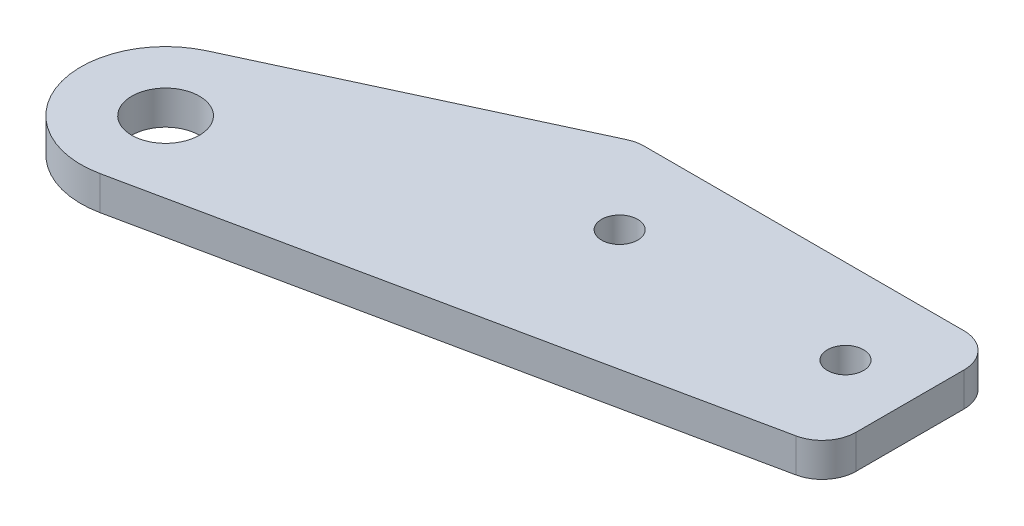
ISO-10303-21;
HEADER;
FILE_DESCRIPTION(('STEP AP214'),'2;1');
FILE_NAME('part.step','',(''),(''),'','','');
FILE_SCHEMA(('AUTOMOTIVE_DESIGN { 1 0 10303 214 1 1 1 1 }'));
ENDSEC;
DATA;
#1=APPLICATION_CONTEXT('core data for automotive mechanical design processes');
#2=APPLICATION_PROTOCOL_DEFINITION('international standard','automotive_design',2000,#1);
#3=PRODUCT_CONTEXT('',#1,'mechanical');
#4=PRODUCT('Part','Part','',(#3));
#5=PRODUCT_RELATED_PRODUCT_CATEGORY('part','',(#4));
#6=PRODUCT_DEFINITION_FORMATION('','',#4);
#7=PRODUCT_DEFINITION_CONTEXT('part definition',#1,'design');
#8=PRODUCT_DEFINITION('design','',#6,#7);
#9=PRODUCT_DEFINITION_SHAPE('','',#8);
#10=(LENGTH_UNIT() NAMED_UNIT(*) SI_UNIT(.MILLI.,.METRE.));
#11=(NAMED_UNIT(*) PLANE_ANGLE_UNIT() SI_UNIT($,.RADIAN.));
#12=(NAMED_UNIT(*) SI_UNIT($,.STERADIAN.) SOLID_ANGLE_UNIT());
#13=UNCERTAINTY_MEASURE_WITH_UNIT(LENGTH_MEASURE(1.E-05),#10,'distance_accuracy_value','');
#14=(GEOMETRIC_REPRESENTATION_CONTEXT(3) GLOBAL_UNCERTAINTY_ASSIGNED_CONTEXT((#13)) GLOBAL_UNIT_ASSIGNED_CONTEXT((#10,
#11,#12)) REPRESENTATION_CONTEXT('',''));
#15=CARTESIAN_POINT('',(0.,0.,0.));
#16=DIRECTION('',(0.,0.,1.));
#17=DIRECTION('',(1.,0.,0.));
#18=AXIS2_PLACEMENT_3D('',#15,#16,#17);
#19=CARTESIAN_POINT('',(1.35277226534862,3.,6.43884459272465));
#20=DIRECTION('',(0.205606744276895,0.,0.97863469522997));
#21=DIRECTION('',(0.97863469522997,0.,-0.205606744276895));
#22=AXIS2_PLACEMENT_3D('',#19,#20,#21);
#23=PLANE('',#22);
#24=DIRECTION('',(-0.97863469522997,0.,0.205606744276895));
#25=VECTOR('',#24,1.);
#26=CARTESIAN_POINT('',(1.35277226534862,0.,6.43884459272465));
#27=LINE('',#26,#25);
#28=CARTESIAN_POINT('',(29.6168202328307,0.,0.50069534152282));
#29=VERTEX_POINT('',#28);
#30=CARTESIAN_POINT('',(-21.3079494179233,0.,11.1997602142248));
#31=VERTEX_POINT('',#30);
#32=EDGE_CURVE('E158',#29,#31,#27,.T.);
#33=ORIENTED_EDGE('',*,*,#32,.F.);
#34=DIRECTION('',(0.,-1.,0.));
#35=VECTOR('',#34,1.);
#36=CARTESIAN_POINT('',(29.6168202328307,3.,0.500695341522821));
#37=LINE('',#36,#35);
#38=CARTESIAN_POINT('',(29.6168202328307,3.,0.50069534152282));
#39=VERTEX_POINT('',#38);
#40=EDGE_CURVE('E11',#29,#39,#37,.F.);
#41=ORIENTED_EDGE('',*,*,#40,.T.);
#42=DIRECTION('',(-0.97863469522997,0.,0.205606744276895));
#43=VECTOR('',#42,1.);
#44=CARTESIAN_POINT('',(1.35277226534862,3.,6.43884459272465));
#45=LINE('',#44,#43);
#46=CARTESIAN_POINT('',(-21.3079494179233,3.,11.1997602142248));
#47=VERTEX_POINT('',#46);
#48=EDGE_CURVE('E185',#39,#47,#45,.T.);
#49=ORIENTED_EDGE('',*,*,#48,.T.);
#50=DIRECTION('',(0.,-1.,0.));
#51=VECTOR('',#50,1.);
#52=CARTESIAN_POINT('',(-21.3079494179233,3.,11.1997602142248));
#53=LINE('',#52,#51);
#54=EDGE_CURVE('E138',#47,#31,#53,.T.);
#55=ORIENTED_EDGE('',*,*,#54,.T.);
#56=EDGE_LOOP('',(#33,#41,#49,#55));
#57=FACE_BOUND('',#56,.T.);
#58=ADVANCED_FACE('F46',(#57),#23,.T.);
#59=CARTESIAN_POINT('',(32.,3.,0.));
#60=DIRECTION('',(-1.,0.,0.));
#61=DIRECTION('',(0.,0.,1.));
#62=AXIS2_PLACEMENT_3D('',#59,#60,#61);
#63=PLANE('',#62);
#64=DIRECTION('',(0.,0.,-1.));
#65=VECTOR('',#64,1.);
#66=CARTESIAN_POINT('',(32.,3.,0.));
#67=LINE('',#66,#65);
#68=CARTESIAN_POINT('',(32.,3.,-2.43520874416709));
#69=VERTEX_POINT('',#68);
#70=CARTESIAN_POINT('',(32.,3.,-12.));
#71=VERTEX_POINT('',#70);
#72=EDGE_CURVE('E219',#69,#71,#67,.T.);
#73=ORIENTED_EDGE('',*,*,#72,.F.);
#74=DIRECTION('',(0.,-1.,0.));
#75=VECTOR('',#74,1.);
#76=CARTESIAN_POINT('',(32.,0.,-2.43520874416709));
#77=LINE('',#76,#75);
#78=CARTESIAN_POINT('',(32.,0.,-2.43520874416709));
#79=VERTEX_POINT('',#78);
#80=EDGE_CURVE('E55',#69,#79,#77,.T.);
#81=ORIENTED_EDGE('',*,*,#80,.T.);
#82=DIRECTION('',(0.,0.,-1.));
#83=VECTOR('',#82,1.);
#84=CARTESIAN_POINT('',(32.,0.,0.));
#85=LINE('',#84,#83);
#86=CARTESIAN_POINT('',(32.,0.,-12.));
#87=VERTEX_POINT('',#86);
#88=EDGE_CURVE('E161',#79,#87,#85,.T.);
#89=ORIENTED_EDGE('',*,*,#88,.T.);
#90=DIRECTION('',(0.,-1.,0.));
#91=VECTOR('',#90,1.);
#92=CARTESIAN_POINT('',(32.,3.,-12.));
#93=LINE('',#92,#91);
#94=EDGE_CURVE('E62',#87,#71,#93,.F.);
#95=ORIENTED_EDGE('',*,*,#94,.T.);
#96=EDGE_LOOP('',(#73,#81,#89,#95));
#97=FACE_BOUND('',#96,.T.);
#98=ADVANCED_FACE('F218',(#97),#63,.F.);
#99=CARTESIAN_POINT('',(0.,3.,-15.));
#100=DIRECTION('',(0.,0.,-1.));
#101=DIRECTION('',(-1.,0.,0.));
#102=AXIS2_PLACEMENT_3D('',#99,#100,#101);
#103=PLANE('',#102);
#104=DIRECTION('',(1.,0.,0.));
#105=VECTOR('',#104,1.);
#106=CARTESIAN_POINT('',(0.,0.,-15.));
#107=LINE('',#106,#105);
#108=CARTESIAN_POINT('',(0.66157955679861,0.,-15.));
#109=VERTEX_POINT('',#108);
#110=CARTESIAN_POINT('',(29.,0.,-15.));
#111=VERTEX_POINT('',#110);
#112=EDGE_CURVE('E164',#109,#111,#107,.T.);
#113=ORIENTED_EDGE('',*,*,#112,.F.);
#114=DIRECTION('',(0.,-1.,0.));
#115=VECTOR('',#114,1.);
#116=CARTESIAN_POINT('',(0.66157955679861,3.,-15.));
#117=LINE('',#116,#115);
#118=CARTESIAN_POINT('',(0.66157955679861,3.,-15.));
#119=VERTEX_POINT('',#118);
#120=EDGE_CURVE('E203',#109,#119,#117,.F.);
#121=ORIENTED_EDGE('',*,*,#120,.T.);
#122=DIRECTION('',(1.,0.,0.));
#123=VECTOR('',#122,1.);
#124=CARTESIAN_POINT('',(0.,3.,-15.));
#125=LINE('',#124,#123);
#126=CARTESIAN_POINT('',(29.,3.,-15.));
#127=VERTEX_POINT('',#126);
#128=EDGE_CURVE('E126',#119,#127,#125,.T.);
#129=ORIENTED_EDGE('',*,*,#128,.T.);
#130=DIRECTION('',(0.,-1.,0.));
#131=VECTOR('',#130,1.);
#132=CARTESIAN_POINT('',(29.,0.,-15.));
#133=LINE('',#132,#131);
#134=EDGE_CURVE('E199',#127,#111,#133,.T.);
#135=ORIENTED_EDGE('',*,*,#134,.T.);
#136=EDGE_LOOP('',(#113,#121,#129,#135));
#137=FACE_BOUND('',#136,.T.);
#138=ADVANCED_FACE('F231',(#137),#103,.T.);
#139=CARTESIAN_POINT('',(-5.72380030257755,3.,-12.3464533523199));
#140=DIRECTION('',(0.420598513841095,0.,0.907246873874285));
#141=DIRECTION('',(0.907246873874285,0.,-0.420598513841095));
#142=AXIS2_PLACEMENT_3D('',#139,#140,#141);
#143=PLANE('',#142);
#144=DIRECTION('',(-0.907246873874285,0.,0.420598513841095));
#145=VECTOR('',#144,1.);
#146=CARTESIAN_POINT('',(-5.72380030257755,3.,-12.3464533523199));
#147=LINE('',#146,#145);
#148=CARTESIAN_POINT('',(-0.600215984724674,3.,-14.7217406216229));
#149=VERTEX_POINT('',#148);
#150=CARTESIAN_POINT('',(-26.0044888538082,3.,-2.94435155405713));
#151=VERTEX_POINT('',#150);
#152=EDGE_CURVE('E112',#149,#151,#147,.T.);
#153=ORIENTED_EDGE('',*,*,#152,.F.);
#154=DIRECTION('',(0.,-1.,0.));
#155=VECTOR('',#154,1.);
#156=CARTESIAN_POINT('',(-0.600215984724673,0.,-14.7217406216229));
#157=LINE('',#156,#155);
#158=CARTESIAN_POINT('',(-0.600215984724674,0.,-14.7217406216229));
#159=VERTEX_POINT('',#158);
#160=EDGE_CURVE('E137',#149,#159,#157,.T.);
#161=ORIENTED_EDGE('',*,*,#160,.T.);
#162=DIRECTION('',(-0.907246873874285,0.,0.420598513841095));
#163=VECTOR('',#162,1.);
#164=CARTESIAN_POINT('',(-5.72380030257755,0.,-12.3464533523199));
#165=LINE('',#164,#163);
#166=CARTESIAN_POINT('',(-26.0044888538082,0.,-2.94435155405713));
#167=VERTEX_POINT('',#166);
#168=EDGE_CURVE('E132',#159,#167,#165,.T.);
#169=ORIENTED_EDGE('',*,*,#168,.T.);
#170=DIRECTION('',(0.,-1.,0.));
#171=VECTOR('',#170,1.);
#172=CARTESIAN_POINT('',(-26.0044888538082,3.,-2.94435155405713));
#173=LINE('',#172,#171);
#174=EDGE_CURVE('E129',#151,#167,#173,.T.);
#175=ORIENTED_EDGE('',*,*,#174,.F.);
#176=EDGE_LOOP('',(#153,#161,#169,#175));
#177=FACE_BOUND('',#176,.T.);
#178=ADVANCED_FACE('F130',(#177),#143,.F.);
#179=CARTESIAN_POINT('',(26.,3.,-7.5));
#180=DIRECTION('',(0.,-1.,0.));
#181=DIRECTION('',(0.,0.,-1.));
#182=AXIS2_PLACEMENT_3D('',#179,#180,#181);
#183=CYLINDRICAL_SURFACE('',#182,1.6);
#184=CARTESIAN_POINT('',(26.,3.,-7.5));
#185=DIRECTION('',(0.,1.,0.));
#186=DIRECTION('',(0.,0.,1.));
#187=AXIS2_PLACEMENT_3D('',#184,#185,#186);
#188=CIRCLE('',#187,1.6);
#189=CARTESIAN_POINT('',(26.,3.,-5.9));
#190=VERTEX_POINT('',#189);
#191=EDGE_CURVE('E147',#190,#190,#188,.T.);
#192=ORIENTED_EDGE('',*,*,#191,.T.);
#193=EDGE_LOOP('',(#192));
#194=FACE_BOUND('',#193,.T.);
#195=CARTESIAN_POINT('',(26.,0.,-7.5));
#196=DIRECTION('',(0.,1.,0.));
#197=DIRECTION('',(0.,0.,1.));
#198=AXIS2_PLACEMENT_3D('',#195,#196,#197);
#199=CIRCLE('',#198,1.6);
#200=CARTESIAN_POINT('',(26.,0.,-5.9));
#201=VERTEX_POINT('',#200);
#202=EDGE_CURVE('E177',#201,#201,#199,.T.);
#203=ORIENTED_EDGE('',*,*,#202,.F.);
#204=EDGE_LOOP('',(#203));
#205=FACE_BOUND('',#204,.T.);
#206=ADVANCED_FACE('F261',(#194,#205),#183,.F.);
#207=CARTESIAN_POINT('',(-22.85,3.,3.86));
#208=DIRECTION('',(0.,-1.,0.));
#209=DIRECTION('',(0.,0.,-1.));
#210=AXIS2_PLACEMENT_3D('',#207,#208,#209);
#211=CYLINDRICAL_SURFACE('',#210,3.);
#212=CARTESIAN_POINT('',(-22.85,3.,3.86));
#213=DIRECTION('',(0.,1.,0.));
#214=DIRECTION('',(0.,0.,1.));
#215=AXIS2_PLACEMENT_3D('',#212,#213,#214);
#216=CIRCLE('',#215,3.);
#217=CARTESIAN_POINT('',(-22.85,3.,6.86));
#218=VERTEX_POINT('',#217);
#219=EDGE_CURVE('E143',#218,#218,#216,.T.);
#220=ORIENTED_EDGE('',*,*,#219,.T.);
#221=EDGE_LOOP('',(#220));
#222=FACE_BOUND('',#221,.T.);
#223=CARTESIAN_POINT('',(-22.85,0.,3.86));
#224=DIRECTION('',(0.,1.,0.));
#225=DIRECTION('',(0.,0.,1.));
#226=AXIS2_PLACEMENT_3D('',#223,#224,#225);
#227=CIRCLE('',#226,3.);
#228=CARTESIAN_POINT('',(-22.85,0.,6.86));
#229=VERTEX_POINT('',#228);
#230=EDGE_CURVE('E173',#229,#229,#227,.T.);
#231=ORIENTED_EDGE('',*,*,#230,.F.);
#232=EDGE_LOOP('',(#231));
#233=FACE_BOUND('',#232,.T.);
#234=ADVANCED_FACE('F265',(#222,#233),#211,.F.);
#235=CARTESIAN_POINT('',(-22.85,3.,3.86));
#236=DIRECTION('',(0.,-1.,0.));
#237=DIRECTION('',(0.,0.,-1.));
#238=AXIS2_PLACEMENT_3D('',#235,#236,#237);
#239=CYLINDRICAL_SURFACE('',#238,7.5);
#240=CARTESIAN_POINT('',(-22.85,0.,3.86));
#241=DIRECTION('',(0.,1.,0.));
#242=DIRECTION('',(0.,0.,1.));
#243=AXIS2_PLACEMENT_3D('',#240,#241,#242);
#244=CIRCLE('',#243,7.5);
#245=EDGE_CURVE('E170',#167,#31,#244,.T.);
#246=ORIENTED_EDGE('',*,*,#245,.T.);
#247=ORIENTED_EDGE('',*,*,#54,.F.);
#248=CARTESIAN_POINT('',(-22.85,3.,3.86));
#249=DIRECTION('',(0.,1.,0.));
#250=DIRECTION('',(0.,0.,1.));
#251=AXIS2_PLACEMENT_3D('',#248,#249,#250);
#252=CIRCLE('',#251,7.5);
#253=EDGE_CURVE('E118',#151,#47,#252,.T.);
#254=ORIENTED_EDGE('',*,*,#253,.F.);
#255=ORIENTED_EDGE('',*,*,#174,.T.);
#256=EDGE_LOOP('',(#246,#247,#254,#255));
#257=FACE_BOUND('',#256,.T.);
#258=ADVANCED_FACE('F140',(#257),#239,.T.);
#259=CARTESIAN_POINT('',(6.,3.,-7.5));
#260=DIRECTION('',(0.,-1.,0.));
#261=DIRECTION('',(0.,0.,-1.));
#262=AXIS2_PLACEMENT_3D('',#259,#260,#261);
#263=CYLINDRICAL_SURFACE('',#262,1.6);
#264=CARTESIAN_POINT('',(6.,3.,-7.5));
#265=DIRECTION('',(0.,1.,0.));
#266=DIRECTION('',(0.,0.,1.));
#267=AXIS2_PLACEMENT_3D('',#264,#265,#266);
#268=CIRCLE('',#267,1.6);
#269=CARTESIAN_POINT('',(6.,3.,-5.9));
#270=VERTEX_POINT('',#269);
#271=EDGE_CURVE('E154',#270,#270,#268,.T.);
#272=ORIENTED_EDGE('',*,*,#271,.T.);
#273=EDGE_LOOP('',(#272));
#274=FACE_BOUND('',#273,.T.);
#275=CARTESIAN_POINT('',(6.,0.,-7.5));
#276=DIRECTION('',(0.,1.,0.));
#277=DIRECTION('',(0.,0.,1.));
#278=AXIS2_PLACEMENT_3D('',#275,#276,#277);
#279=CIRCLE('',#278,1.6);
#280=CARTESIAN_POINT('',(6.,0.,-5.9));
#281=VERTEX_POINT('',#280);
#282=EDGE_CURVE('E181',#281,#281,#279,.T.);
#283=ORIENTED_EDGE('',*,*,#282,.F.);
#284=EDGE_LOOP('',(#283));
#285=FACE_BOUND('',#284,.T.);
#286=ADVANCED_FACE('F264',(#274,#285),#263,.F.);
#287=CARTESIAN_POINT('',(0.,3.,0.));
#288=DIRECTION('',(0.,1.,0.));
#289=DIRECTION('',(0.,0.,1.));
#290=AXIS2_PLACEMENT_3D('',#287,#288,#289);
#291=PLANE('',#290);
#292=ORIENTED_EDGE('',*,*,#128,.F.);
#293=CARTESIAN_POINT('',(0.66157955679861,3.,-12.));
#294=DIRECTION('',(0.,1.,0.));
#295=DIRECTION('',(0.,0.,1.));
#296=AXIS2_PLACEMENT_3D('',#293,#294,#295);
#297=CIRCLE('',#296,3.);
#298=EDGE_CURVE('E121',#119,#149,#297,.T.);
#299=ORIENTED_EDGE('',*,*,#298,.T.);
#300=ORIENTED_EDGE('',*,*,#152,.T.);
#301=ORIENTED_EDGE('',*,*,#253,.T.);
#302=ORIENTED_EDGE('',*,*,#48,.F.);
#303=CARTESIAN_POINT('',(29.,3.,-2.43520874416709));
#304=DIRECTION('',(0.,1.,0.));
#305=DIRECTION('',(0.,0.,1.));
#306=AXIS2_PLACEMENT_3D('',#303,#304,#305);
#307=CIRCLE('',#306,3.);
#308=EDGE_CURVE('E69',#39,#69,#307,.T.);
#309=ORIENTED_EDGE('',*,*,#308,.T.);
#310=ORIENTED_EDGE('',*,*,#72,.T.);
#311=CARTESIAN_POINT('',(29.,3.,-12.));
#312=DIRECTION('',(0.,1.,0.));
#313=DIRECTION('',(0.,0.,1.));
#314=AXIS2_PLACEMENT_3D('',#311,#312,#313);
#315=CIRCLE('',#314,3.);
#316=EDGE_CURVE('E206',#71,#127,#315,.T.);
#317=ORIENTED_EDGE('',*,*,#316,.T.);
#318=EDGE_LOOP('',(#292,#299,#300,#301,#302,#309,#310,#317));
#319=FACE_BOUND('',#318,.T.);
#320=ORIENTED_EDGE('',*,*,#219,.F.);
#321=EDGE_LOOP('',(#320));
#322=FACE_BOUND('',#321,.T.);
#323=ORIENTED_EDGE('',*,*,#191,.F.);
#324=EDGE_LOOP('',(#323));
#325=FACE_BOUND('',#324,.T.);
#326=ORIENTED_EDGE('',*,*,#271,.F.);
#327=EDGE_LOOP('',(#326));
#328=FACE_BOUND('',#327,.T.);
#329=ADVANCED_FACE('F115',(#319,#322,#325,#328),#291,.T.);
#330=CARTESIAN_POINT('',(0.,0.,0.));
#331=DIRECTION('',(0.,1.,0.));
#332=DIRECTION('',(0.,0.,1.));
#333=AXIS2_PLACEMENT_3D('',#330,#331,#332);
#334=PLANE('',#333);
#335=ORIENTED_EDGE('',*,*,#168,.F.);
#336=CARTESIAN_POINT('',(0.66157955679861,0.,-12.));
#337=DIRECTION('',(0.,1.,0.));
#338=DIRECTION('',(0.,0.,1.));
#339=AXIS2_PLACEMENT_3D('',#336,#337,#338);
#340=CIRCLE('',#339,3.);
#341=EDGE_CURVE('E196',#159,#109,#340,.F.);
#342=ORIENTED_EDGE('',*,*,#341,.T.);
#343=ORIENTED_EDGE('',*,*,#112,.T.);
#344=CARTESIAN_POINT('',(29.,0.,-12.));
#345=DIRECTION('',(0.,1.,0.));
#346=DIRECTION('',(0.,0.,1.));
#347=AXIS2_PLACEMENT_3D('',#344,#345,#346);
#348=CIRCLE('',#347,3.);
#349=EDGE_CURVE('E190',#111,#87,#348,.F.);
#350=ORIENTED_EDGE('',*,*,#349,.T.);
#351=ORIENTED_EDGE('',*,*,#88,.F.);
#352=CARTESIAN_POINT('',(29.,0.,-2.43520874416709));
#353=DIRECTION('',(0.,1.,0.));
#354=DIRECTION('',(0.,0.,1.));
#355=AXIS2_PLACEMENT_3D('',#352,#353,#354);
#356=CIRCLE('',#355,3.);
#357=EDGE_CURVE('E193',#79,#29,#356,.F.);
#358=ORIENTED_EDGE('',*,*,#357,.T.);
#359=ORIENTED_EDGE('',*,*,#32,.T.);
#360=ORIENTED_EDGE('',*,*,#245,.F.);
#361=EDGE_LOOP('',(#335,#342,#343,#350,#351,#358,#359,#360));
#362=FACE_BOUND('',#361,.T.);
#363=ORIENTED_EDGE('',*,*,#230,.T.);
#364=EDGE_LOOP('',(#363));
#365=FACE_BOUND('',#364,.T.);
#366=ORIENTED_EDGE('',*,*,#202,.T.);
#367=EDGE_LOOP('',(#366));
#368=FACE_BOUND('',#367,.T.);
#369=ORIENTED_EDGE('',*,*,#282,.T.);
#370=EDGE_LOOP('',(#369));
#371=FACE_BOUND('',#370,.T.);
#372=ADVANCED_FACE('F222',(#362,#365,#368,#371),#334,.F.);
#373=CARTESIAN_POINT('',(0.66157955679861,3.,-12.));
#374=DIRECTION('',(0.,1.,0.));
#375=DIRECTION('',(0.,0.,1.));
#376=AXIS2_PLACEMENT_3D('',#373,#374,#375);
#377=CYLINDRICAL_SURFACE('',#376,3.);
#378=ORIENTED_EDGE('',*,*,#298,.F.);
#379=ORIENTED_EDGE('',*,*,#120,.F.);
#380=ORIENTED_EDGE('',*,*,#341,.F.);
#381=ORIENTED_EDGE('',*,*,#160,.F.);
#382=EDGE_LOOP('',(#378,#379,#380,#381));
#383=FACE_BOUND('',#382,.T.);
#384=ADVANCED_FACE('F242',(#383),#377,.T.);
#385=CARTESIAN_POINT('',(29.,3.,-2.43520874416709));
#386=DIRECTION('',(0.,1.,0.));
#387=DIRECTION('',(0.,0.,1.));
#388=AXIS2_PLACEMENT_3D('',#385,#386,#387);
#389=CYLINDRICAL_SURFACE('',#388,3.);
#390=ORIENTED_EDGE('',*,*,#308,.F.);
#391=ORIENTED_EDGE('',*,*,#40,.F.);
#392=ORIENTED_EDGE('',*,*,#357,.F.);
#393=ORIENTED_EDGE('',*,*,#80,.F.);
#394=EDGE_LOOP('',(#390,#391,#392,#393));
#395=FACE_BOUND('',#394,.T.);
#396=ADVANCED_FACE('F240',(#395),#389,.T.);
#397=CARTESIAN_POINT('',(29.,3.,-12.));
#398=DIRECTION('',(0.,1.,0.));
#399=DIRECTION('',(0.,0.,1.));
#400=AXIS2_PLACEMENT_3D('',#397,#398,#399);
#401=CYLINDRICAL_SURFACE('',#400,3.);
#402=ORIENTED_EDGE('',*,*,#316,.F.);
#403=ORIENTED_EDGE('',*,*,#94,.F.);
#404=ORIENTED_EDGE('',*,*,#349,.F.);
#405=ORIENTED_EDGE('',*,*,#134,.F.);
#406=EDGE_LOOP('',(#402,#403,#404,#405));
#407=FACE_BOUND('',#406,.T.);
#408=ADVANCED_FACE('F48',(#407),#401,.T.);
#409=CLOSED_SHELL('',(#58,#98,#138,#178,#206,#234,#258,#286,#329,#372,#384,#396,#408));
#410=MANIFOLD_SOLID_BREP('B2',#409);
#411=ADVANCED_BREP_SHAPE_REPRESENTATION('',(#18,#410),#14);
#412=SHAPE_DEFINITION_REPRESENTATION(#9,#411);
ENDSEC;
END-ISO-10303-21;
